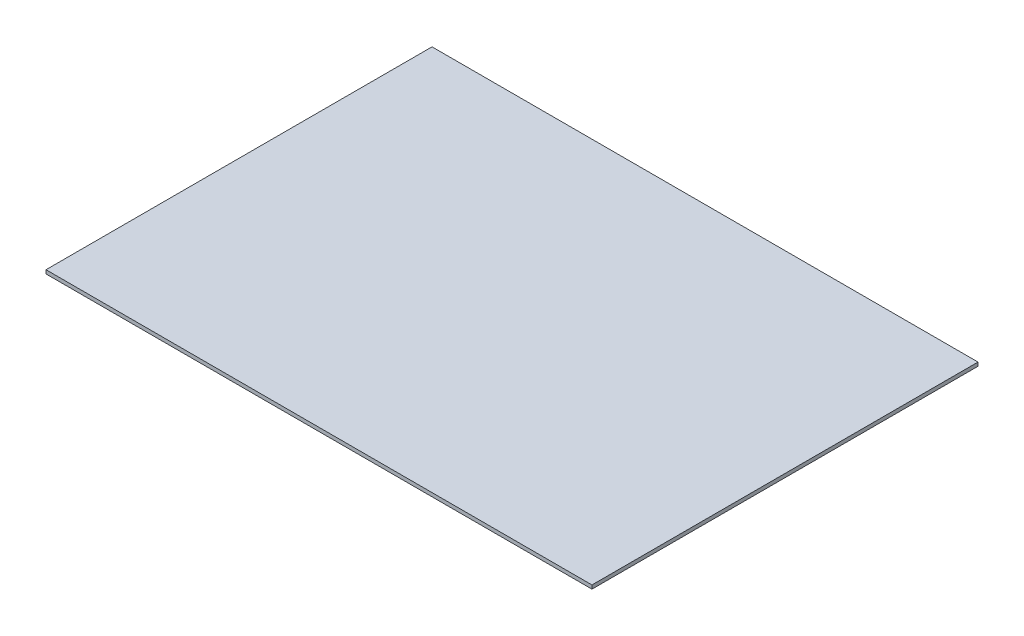
ISO-10303-21;
HEADER;
FILE_DESCRIPTION(('STEP AP214'),'2;1');
FILE_NAME('part.step','',(''),(''),'','','');
FILE_SCHEMA(('AUTOMOTIVE_DESIGN { 1 0 10303 214 1 1 1 1 }'));
ENDSEC;
DATA;
#1=APPLICATION_CONTEXT('core data for automotive mechanical design processes');
#2=APPLICATION_PROTOCOL_DEFINITION('international standard','automotive_design',2000,#1);
#3=PRODUCT_CONTEXT('',#1,'mechanical');
#4=PRODUCT('Part','Part','',(#3));
#5=PRODUCT_RELATED_PRODUCT_CATEGORY('part','',(#4));
#6=PRODUCT_DEFINITION_FORMATION('','',#4);
#7=PRODUCT_DEFINITION_CONTEXT('part definition',#1,'design');
#8=PRODUCT_DEFINITION('design','',#6,#7);
#9=PRODUCT_DEFINITION_SHAPE('','',#8);
#10=(LENGTH_UNIT() NAMED_UNIT(*) SI_UNIT(.MILLI.,.METRE.));
#11=(NAMED_UNIT(*) PLANE_ANGLE_UNIT() SI_UNIT($,.RADIAN.));
#12=(NAMED_UNIT(*) SI_UNIT($,.STERADIAN.) SOLID_ANGLE_UNIT());
#13=UNCERTAINTY_MEASURE_WITH_UNIT(LENGTH_MEASURE(1.E-05),#10,'distance_accuracy_value','');
#14=(GEOMETRIC_REPRESENTATION_CONTEXT(3) GLOBAL_UNCERTAINTY_ASSIGNED_CONTEXT((#13)) GLOBAL_UNIT_ASSIGNED_CONTEXT((#10,
#11,#12)) REPRESENTATION_CONTEXT('',''));
#15=CARTESIAN_POINT('',(0.,0.,0.));
#16=DIRECTION('',(0.,0.,1.));
#17=DIRECTION('',(1.,0.,0.));
#18=AXIS2_PLACEMENT_3D('',#15,#16,#17);
#19=CARTESIAN_POINT('',(0.,2.,0.));
#20=DIRECTION('',(-1.,0.,0.));
#21=DIRECTION('',(0.,0.,1.));
#22=AXIS2_PLACEMENT_3D('',#19,#20,#21);
#23=PLANE('',#22);
#24=DIRECTION('',(0.,0.,-1.));
#25=VECTOR('',#24,1.);
#26=CARTESIAN_POINT('',(0.,0.,0.));
#27=LINE('',#26,#25);
#28=CARTESIAN_POINT('',(0.,0.,0.));
#29=VERTEX_POINT('',#28);
#30=CARTESIAN_POINT('',(0.,0.,-210.));
#31=VERTEX_POINT('',#30);
#32=EDGE_CURVE('E95',#29,#31,#27,.T.);
#33=ORIENTED_EDGE('',*,*,#32,.T.);
#34=DIRECTION('',(0.,-1.,0.));
#35=VECTOR('',#34,1.);
#36=CARTESIAN_POINT('',(0.,2.,-210.));
#37=LINE('',#36,#35);
#38=CARTESIAN_POINT('',(0.,2.,-210.));
#39=VERTEX_POINT('',#38);
#40=EDGE_CURVE('E11',#39,#31,#37,.T.);
#41=ORIENTED_EDGE('',*,*,#40,.F.);
#42=DIRECTION('',(0.,0.,-1.));
#43=VECTOR('',#42,1.);
#44=CARTESIAN_POINT('',(0.,2.,0.));
#45=LINE('',#44,#43);
#46=CARTESIAN_POINT('',(0.,2.,0.));
#47=VERTEX_POINT('',#46);
#48=EDGE_CURVE('E83',#47,#39,#45,.T.);
#49=ORIENTED_EDGE('',*,*,#48,.F.);
#50=DIRECTION('',(0.,-1.,0.));
#51=VECTOR('',#50,1.);
#52=CARTESIAN_POINT('',(0.,2.,0.));
#53=LINE('',#52,#51);
#54=EDGE_CURVE('E91',#47,#29,#53,.T.);
#55=ORIENTED_EDGE('',*,*,#54,.T.);
#56=EDGE_LOOP('',(#33,#41,#49,#55));
#57=FACE_BOUND('',#56,.T.);
#58=ADVANCED_FACE('F32',(#57),#23,.F.);
#59=CARTESIAN_POINT('',(0.,2.,-210.));
#60=DIRECTION('',(0.,0.,1.));
#61=DIRECTION('',(1.,0.,0.));
#62=AXIS2_PLACEMENT_3D('',#59,#60,#61);
#63=PLANE('',#62);
#64=DIRECTION('',(-1.,0.,0.));
#65=VECTOR('',#64,1.);
#66=CARTESIAN_POINT('',(0.,0.,-210.));
#67=LINE('',#66,#65);
#68=CARTESIAN_POINT('',(-297.,0.,-210.));
#69=VERTEX_POINT('',#68);
#70=EDGE_CURVE('E87',#31,#69,#67,.T.);
#71=ORIENTED_EDGE('',*,*,#70,.T.);
#72=DIRECTION('',(0.,-1.,0.));
#73=VECTOR('',#72,1.);
#74=CARTESIAN_POINT('',(-297.,2.,-210.));
#75=LINE('',#74,#73);
#76=CARTESIAN_POINT('',(-297.,2.,-210.));
#77=VERTEX_POINT('',#76);
#78=EDGE_CURVE('E40',#77,#69,#75,.T.);
#79=ORIENTED_EDGE('',*,*,#78,.F.);
#80=DIRECTION('',(-1.,0.,0.));
#81=VECTOR('',#80,1.);
#82=CARTESIAN_POINT('',(0.,2.,-210.));
#83=LINE('',#82,#81);
#84=EDGE_CURVE('E78',#39,#77,#83,.T.);
#85=ORIENTED_EDGE('',*,*,#84,.F.);
#86=ORIENTED_EDGE('',*,*,#40,.T.);
#87=EDGE_LOOP('',(#71,#79,#85,#86));
#88=FACE_BOUND('',#87,.T.);
#89=ADVANCED_FACE('F86',(#88),#63,.F.);
#90=CARTESIAN_POINT('',(-297.,2.,0.));
#91=DIRECTION('',(1.,0.,0.));
#92=DIRECTION('',(0.,0.,-1.));
#93=AXIS2_PLACEMENT_3D('',#90,#91,#92);
#94=PLANE('',#93);
#95=DIRECTION('',(0.,0.,1.));
#96=VECTOR('',#95,1.);
#97=CARTESIAN_POINT('',(-297.,0.,0.));
#98=LINE('',#97,#96);
#99=CARTESIAN_POINT('',(-297.,0.,0.));
#100=VERTEX_POINT('',#99);
#101=EDGE_CURVE('E65',#69,#100,#98,.T.);
#102=ORIENTED_EDGE('',*,*,#101,.T.);
#103=DIRECTION('',(0.,-1.,0.));
#104=VECTOR('',#103,1.);
#105=CARTESIAN_POINT('',(-297.,2.,0.));
#106=LINE('',#105,#104);
#107=CARTESIAN_POINT('',(-297.,2.,0.));
#108=VERTEX_POINT('',#107);
#109=EDGE_CURVE('E88',#108,#100,#106,.T.);
#110=ORIENTED_EDGE('',*,*,#109,.F.);
#111=DIRECTION('',(0.,0.,1.));
#112=VECTOR('',#111,1.);
#113=CARTESIAN_POINT('',(-297.,2.,0.));
#114=LINE('',#113,#112);
#115=EDGE_CURVE('E81',#77,#108,#114,.T.);
#116=ORIENTED_EDGE('',*,*,#115,.F.);
#117=ORIENTED_EDGE('',*,*,#78,.T.);
#118=EDGE_LOOP('',(#102,#110,#116,#117));
#119=FACE_BOUND('',#118,.T.);
#120=ADVANCED_FACE('F89',(#119),#94,.F.);
#121=CARTESIAN_POINT('',(0.,2.,0.));
#122=DIRECTION('',(0.,0.,-1.));
#123=DIRECTION('',(-1.,0.,0.));
#124=AXIS2_PLACEMENT_3D('',#121,#122,#123);
#125=PLANE('',#124);
#126=DIRECTION('',(1.,0.,0.));
#127=VECTOR('',#126,1.);
#128=CARTESIAN_POINT('',(0.,0.,0.));
#129=LINE('',#128,#127);
#130=EDGE_CURVE('E71',#100,#29,#129,.T.);
#131=ORIENTED_EDGE('',*,*,#130,.T.);
#132=ORIENTED_EDGE('',*,*,#54,.F.);
#133=DIRECTION('',(1.,0.,0.));
#134=VECTOR('',#133,1.);
#135=CARTESIAN_POINT('',(0.,2.,0.));
#136=LINE('',#135,#134);
#137=EDGE_CURVE('E48',#108,#47,#136,.T.);
#138=ORIENTED_EDGE('',*,*,#137,.F.);
#139=ORIENTED_EDGE('',*,*,#109,.T.);
#140=EDGE_LOOP('',(#131,#132,#138,#139));
#141=FACE_BOUND('',#140,.T.);
#142=ADVANCED_FACE('F102',(#141),#125,.F.);
#143=CARTESIAN_POINT('',(0.,2.,0.));
#144=DIRECTION('',(0.,1.,0.));
#145=DIRECTION('',(0.,0.,1.));
#146=AXIS2_PLACEMENT_3D('',#143,#144,#145);
#147=PLANE('',#146);
#148=ORIENTED_EDGE('',*,*,#48,.T.);
#149=ORIENTED_EDGE('',*,*,#84,.T.);
#150=ORIENTED_EDGE('',*,*,#115,.T.);
#151=ORIENTED_EDGE('',*,*,#137,.T.);
#152=EDGE_LOOP('',(#148,#149,#150,#151));
#153=FACE_BOUND('',#152,.T.);
#154=ADVANCED_FACE('F79',(#153),#147,.T.);
#155=CARTESIAN_POINT('',(0.,0.,0.));
#156=DIRECTION('',(0.,1.,0.));
#157=DIRECTION('',(0.,0.,1.));
#158=AXIS2_PLACEMENT_3D('',#155,#156,#157);
#159=PLANE('',#158);
#160=ORIENTED_EDGE('',*,*,#32,.F.);
#161=ORIENTED_EDGE('',*,*,#130,.F.);
#162=ORIENTED_EDGE('',*,*,#101,.F.);
#163=ORIENTED_EDGE('',*,*,#70,.F.);
#164=EDGE_LOOP('',(#160,#161,#162,#163));
#165=FACE_BOUND('',#164,.T.);
#166=ADVANCED_FACE('F105',(#165),#159,.F.);
#167=CLOSED_SHELL('',(#58,#89,#120,#142,#154,#166));
#168=MANIFOLD_SOLID_BREP('B2',#167);
#169=ADVANCED_BREP_SHAPE_REPRESENTATION('',(#18,#168),#14);
#170=SHAPE_DEFINITION_REPRESENTATION(#9,#169);
ENDSEC;
END-ISO-10303-21;
